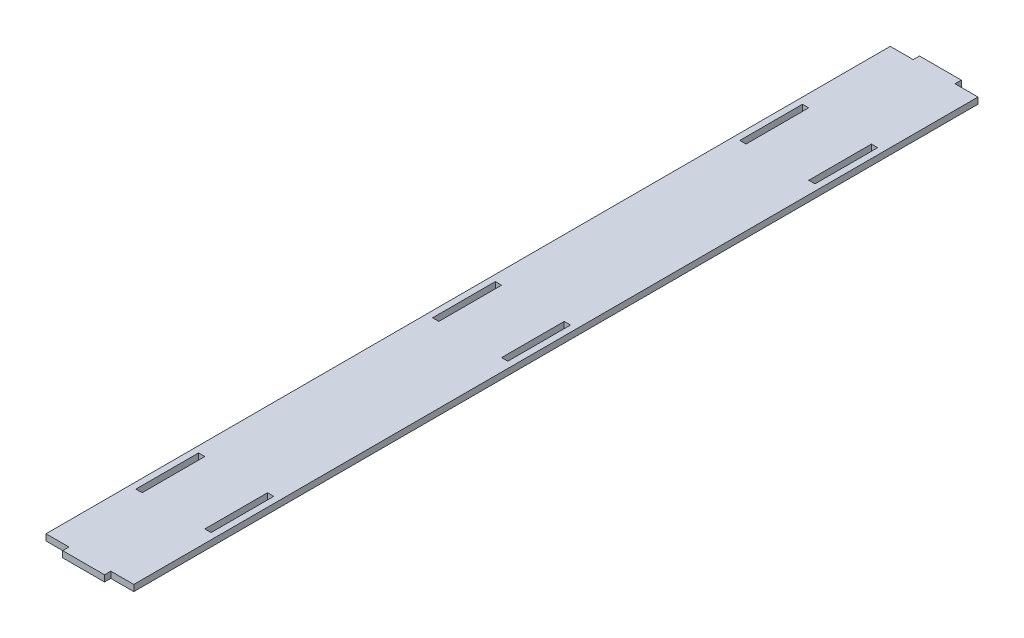
ISO-10303-21;
HEADER;
FILE_DESCRIPTION(('STEP AP214'),'2;1');
FILE_NAME('part.step','',(''),(''),'','','');
FILE_SCHEMA(('AUTOMOTIVE_DESIGN { 1 0 10303 214 1 1 1 1 }'));
ENDSEC;
DATA;
#1=APPLICATION_CONTEXT('core data for automotive mechanical design processes');
#2=APPLICATION_PROTOCOL_DEFINITION('international standard','automotive_design',2000,#1);
#3=PRODUCT_CONTEXT('',#1,'mechanical');
#4=PRODUCT('Part','Part','',(#3));
#5=PRODUCT_RELATED_PRODUCT_CATEGORY('part','',(#4));
#6=PRODUCT_DEFINITION_FORMATION('','',#4);
#7=PRODUCT_DEFINITION_CONTEXT('part definition',#1,'design');
#8=PRODUCT_DEFINITION('design','',#6,#7);
#9=PRODUCT_DEFINITION_SHAPE('','',#8);
#10=(LENGTH_UNIT() NAMED_UNIT(*) SI_UNIT(.MILLI.,.METRE.));
#11=(NAMED_UNIT(*) PLANE_ANGLE_UNIT() SI_UNIT($,.RADIAN.));
#12=(NAMED_UNIT(*) SI_UNIT($,.STERADIAN.) SOLID_ANGLE_UNIT());
#13=UNCERTAINTY_MEASURE_WITH_UNIT(LENGTH_MEASURE(1.E-05),#10,'distance_accuracy_value','');
#14=(GEOMETRIC_REPRESENTATION_CONTEXT(3) GLOBAL_UNCERTAINTY_ASSIGNED_CONTEXT((#13)) GLOBAL_UNIT_ASSIGNED_CONTEXT((#10,
#11,#12)) REPRESENTATION_CONTEXT('',''));
#15=CARTESIAN_POINT('',(0.,0.,0.));
#16=DIRECTION('',(0.,0.,1.));
#17=DIRECTION('',(1.,0.,0.));
#18=AXIS2_PLACEMENT_3D('',#15,#16,#17);
#19=CARTESIAN_POINT('',(0.,3.,-70.));
#20=DIRECTION('',(0.,0.,-1.));
#21=DIRECTION('',(-1.,0.,0.));
#22=AXIS2_PLACEMENT_3D('',#19,#20,#21);
#23=PLANE('',#22);
#24=DIRECTION('',(1.,0.,0.));
#25=VECTOR('',#24,1.);
#26=CARTESIAN_POINT('',(0.,0.,-70.));
#27=LINE('',#26,#25);
#28=CARTESIAN_POINT('',(36.,0.,-70.));
#29=VERTEX_POINT('',#28);
#30=CARTESIAN_POINT('',(39.,0.,-70.));
#31=VERTEX_POINT('',#30);
#32=EDGE_CURVE('E394',#29,#31,#27,.T.);
#33=ORIENTED_EDGE('',*,*,#32,.T.);
#34=DIRECTION('',(0.,-1.,0.));
#35=VECTOR('',#34,1.);
#36=CARTESIAN_POINT('',(39.,3.,-70.));
#37=LINE('',#36,#35);
#38=CARTESIAN_POINT('',(39.,3.,-70.));
#39=VERTEX_POINT('',#38);
#40=EDGE_CURVE('E11',#39,#31,#37,.T.);
#41=ORIENTED_EDGE('',*,*,#40,.F.);
#42=DIRECTION('',(1.,0.,0.));
#43=VECTOR('',#42,1.);
#44=CARTESIAN_POINT('',(0.,3.,-70.));
#45=LINE('',#44,#43);
#46=CARTESIAN_POINT('',(36.,3.,-70.));
#47=VERTEX_POINT('',#46);
#48=EDGE_CURVE('E282',#47,#39,#45,.T.);
#49=ORIENTED_EDGE('',*,*,#48,.F.);
#50=DIRECTION('',(0.,-1.,0.));
#51=VECTOR('',#50,1.);
#52=CARTESIAN_POINT('',(36.,3.,-70.));
#53=LINE('',#52,#51);
#54=EDGE_CURVE('E54',#47,#29,#53,.T.);
#55=ORIENTED_EDGE('',*,*,#54,.T.);
#56=EDGE_LOOP('',(#33,#41,#49,#55));
#57=FACE_BOUND('',#56,.T.);
#58=ADVANCED_FACE('F35',(#57),#23,.F.);
#59=CARTESIAN_POINT('',(39.,3.,0.));
#60=DIRECTION('',(1.,0.,0.));
#61=DIRECTION('',(0.,0.,-1.));
#62=AXIS2_PLACEMENT_3D('',#59,#60,#61);
#63=PLANE('',#62);
#64=DIRECTION('',(0.,0.,1.));
#65=VECTOR('',#64,1.);
#66=CARTESIAN_POINT('',(39.,0.,0.));
#67=LINE('',#66,#65);
#68=CARTESIAN_POINT('',(39.,0.,-40.));
#69=VERTEX_POINT('',#68);
#70=EDGE_CURVE('E288',#31,#69,#67,.T.);
#71=ORIENTED_EDGE('',*,*,#70,.T.);
#72=DIRECTION('',(0.,-1.,0.));
#73=VECTOR('',#72,1.);
#74=CARTESIAN_POINT('',(39.,3.,-40.));
#75=LINE('',#74,#73);
#76=CARTESIAN_POINT('',(39.,3.,-40.));
#77=VERTEX_POINT('',#76);
#78=EDGE_CURVE('E45',#77,#69,#75,.T.);
#79=ORIENTED_EDGE('',*,*,#78,.F.);
#80=DIRECTION('',(0.,0.,1.));
#81=VECTOR('',#80,1.);
#82=CARTESIAN_POINT('',(39.,3.,0.));
#83=LINE('',#82,#81);
#84=EDGE_CURVE('E276',#39,#77,#83,.T.);
#85=ORIENTED_EDGE('',*,*,#84,.F.);
#86=ORIENTED_EDGE('',*,*,#40,.T.);
#87=EDGE_LOOP('',(#71,#79,#85,#86));
#88=FACE_BOUND('',#87,.T.);
#89=ADVANCED_FACE('F287',(#88),#63,.F.);
#90=CARTESIAN_POINT('',(0.,3.,-40.));
#91=DIRECTION('',(0.,0.,-1.));
#92=DIRECTION('',(-1.,0.,0.));
#93=AXIS2_PLACEMENT_3D('',#90,#91,#92);
#94=PLANE('',#93);
#95=DIRECTION('',(1.,0.,0.));
#96=VECTOR('',#95,1.);
#97=CARTESIAN_POINT('',(0.,0.,-40.));
#98=LINE('',#97,#96);
#99=CARTESIAN_POINT('',(36.,0.,-40.));
#100=VERTEX_POINT('',#99);
#101=EDGE_CURVE('E397',#100,#69,#98,.T.);
#102=ORIENTED_EDGE('',*,*,#101,.F.);
#103=DIRECTION('',(0.,-1.,0.));
#104=VECTOR('',#103,1.);
#105=CARTESIAN_POINT('',(36.,3.,-40.));
#106=LINE('',#105,#104);
#107=CARTESIAN_POINT('',(36.,3.,-40.));
#108=VERTEX_POINT('',#107);
#109=EDGE_CURVE('E164',#108,#100,#106,.T.);
#110=ORIENTED_EDGE('',*,*,#109,.F.);
#111=DIRECTION('',(1.,0.,0.));
#112=VECTOR('',#111,1.);
#113=CARTESIAN_POINT('',(0.,3.,-40.));
#114=LINE('',#113,#112);
#115=EDGE_CURVE('E281',#108,#77,#114,.T.);
#116=ORIENTED_EDGE('',*,*,#115,.T.);
#117=ORIENTED_EDGE('',*,*,#78,.T.);
#118=EDGE_LOOP('',(#102,#110,#116,#117));
#119=FACE_BOUND('',#118,.T.);
#120=ADVANCED_FACE('F292',(#119),#94,.T.);
#121=CARTESIAN_POINT('',(0.,3.,-212.));
#122=DIRECTION('',(0.,0.,-1.));
#123=DIRECTION('',(-1.,0.,0.));
#124=AXIS2_PLACEMENT_3D('',#121,#122,#123);
#125=PLANE('',#124);
#126=DIRECTION('',(1.,0.,0.));
#127=VECTOR('',#126,1.);
#128=CARTESIAN_POINT('',(0.,0.,-212.));
#129=LINE('',#128,#127);
#130=CARTESIAN_POINT('',(36.,0.,-212.));
#131=VERTEX_POINT('',#130);
#132=CARTESIAN_POINT('',(39.,0.,-212.));
#133=VERTEX_POINT('',#132);
#134=EDGE_CURVE('E382',#131,#133,#129,.T.);
#135=ORIENTED_EDGE('',*,*,#134,.T.);
#136=DIRECTION('',(0.,-1.,0.));
#137=VECTOR('',#136,1.);
#138=CARTESIAN_POINT('',(39.,3.,-212.));
#139=LINE('',#138,#137);
#140=CARTESIAN_POINT('',(39.,3.,-212.));
#141=VERTEX_POINT('',#140);
#142=EDGE_CURVE('E404',#141,#133,#139,.T.);
#143=ORIENTED_EDGE('',*,*,#142,.F.);
#144=DIRECTION('',(1.,0.,0.));
#145=VECTOR('',#144,1.);
#146=CARTESIAN_POINT('',(0.,3.,-212.));
#147=LINE('',#146,#145);
#148=CARTESIAN_POINT('',(36.,3.,-212.));
#149=VERTEX_POINT('',#148);
#150=EDGE_CURVE('E874',#149,#141,#147,.T.);
#151=ORIENTED_EDGE('',*,*,#150,.F.);
#152=DIRECTION('',(0.,-1.,0.));
#153=VECTOR('',#152,1.);
#154=CARTESIAN_POINT('',(36.,3.,-212.));
#155=LINE('',#154,#153);
#156=EDGE_CURVE('E406',#149,#131,#155,.T.);
#157=ORIENTED_EDGE('',*,*,#156,.T.);
#158=EDGE_LOOP('',(#135,#143,#151,#157));
#159=FACE_BOUND('',#158,.T.);
#160=ADVANCED_FACE('F519',(#159),#125,.F.);
#161=CARTESIAN_POINT('',(39.,3.,0.));
#162=DIRECTION('',(1.,0.,0.));
#163=DIRECTION('',(0.,0.,-1.));
#164=AXIS2_PLACEMENT_3D('',#161,#162,#163);
#165=PLANE('',#164);
#166=DIRECTION('',(0.,0.,1.));
#167=VECTOR('',#166,1.);
#168=CARTESIAN_POINT('',(39.,0.,0.));
#169=LINE('',#168,#167);
#170=CARTESIAN_POINT('',(39.,0.,-182.));
#171=VERTEX_POINT('',#170);
#172=EDGE_CURVE('E385',#133,#171,#169,.T.);
#173=ORIENTED_EDGE('',*,*,#172,.T.);
#174=DIRECTION('',(0.,-1.,0.));
#175=VECTOR('',#174,1.);
#176=CARTESIAN_POINT('',(39.,3.,-182.));
#177=LINE('',#176,#175);
#178=CARTESIAN_POINT('',(39.,3.,-182.));
#179=VERTEX_POINT('',#178);
#180=EDGE_CURVE('E411',#179,#171,#177,.T.);
#181=ORIENTED_EDGE('',*,*,#180,.F.);
#182=DIRECTION('',(0.,0.,1.));
#183=VECTOR('',#182,1.);
#184=CARTESIAN_POINT('',(39.,3.,0.));
#185=LINE('',#184,#183);
#186=EDGE_CURVE('E872',#141,#179,#185,.T.);
#187=ORIENTED_EDGE('',*,*,#186,.F.);
#188=ORIENTED_EDGE('',*,*,#142,.T.);
#189=EDGE_LOOP('',(#173,#181,#187,#188));
#190=FACE_BOUND('',#189,.T.);
#191=ADVANCED_FACE('F515',(#190),#165,.F.);
#192=CARTESIAN_POINT('',(0.,3.,-182.));
#193=DIRECTION('',(0.,0.,-1.));
#194=DIRECTION('',(-1.,0.,0.));
#195=AXIS2_PLACEMENT_3D('',#192,#193,#194);
#196=PLANE('',#195);
#197=DIRECTION('',(1.,0.,0.));
#198=VECTOR('',#197,1.);
#199=CARTESIAN_POINT('',(0.,0.,-182.));
#200=LINE('',#199,#198);
#201=CARTESIAN_POINT('',(36.,0.,-182.));
#202=VERTEX_POINT('',#201);
#203=EDGE_CURVE('E388',#202,#171,#200,.T.);
#204=ORIENTED_EDGE('',*,*,#203,.F.);
#205=DIRECTION('',(0.,-1.,0.));
#206=VECTOR('',#205,1.);
#207=CARTESIAN_POINT('',(36.,3.,-182.));
#208=LINE('',#207,#206);
#209=CARTESIAN_POINT('',(36.,3.,-182.));
#210=VERTEX_POINT('',#209);
#211=EDGE_CURVE('E408',#210,#202,#208,.T.);
#212=ORIENTED_EDGE('',*,*,#211,.F.);
#213=DIRECTION('',(1.,0.,0.));
#214=VECTOR('',#213,1.);
#215=CARTESIAN_POINT('',(0.,3.,-182.));
#216=LINE('',#215,#214);
#217=EDGE_CURVE('E867',#210,#179,#216,.T.);
#218=ORIENTED_EDGE('',*,*,#217,.T.);
#219=ORIENTED_EDGE('',*,*,#180,.T.);
#220=EDGE_LOOP('',(#204,#212,#218,#219));
#221=FACE_BOUND('',#220,.T.);
#222=ADVANCED_FACE('F511',(#221),#196,.T.);
#223=CARTESIAN_POINT('',(0.,3.,-359.));
#224=DIRECTION('',(0.,0.,-1.));
#225=DIRECTION('',(-1.,0.,0.));
#226=AXIS2_PLACEMENT_3D('',#223,#224,#225);
#227=PLANE('',#226);
#228=DIRECTION('',(1.,0.,0.));
#229=VECTOR('',#228,1.);
#230=CARTESIAN_POINT('',(0.,0.,-359.));
#231=LINE('',#230,#229);
#232=CARTESIAN_POINT('',(36.,0.,-359.));
#233=VERTEX_POINT('',#232);
#234=CARTESIAN_POINT('',(39.,0.,-359.));
#235=VERTEX_POINT('',#234);
#236=EDGE_CURVE('E370',#233,#235,#231,.T.);
#237=ORIENTED_EDGE('',*,*,#236,.T.);
#238=DIRECTION('',(0.,-1.,0.));
#239=VECTOR('',#238,1.);
#240=CARTESIAN_POINT('',(39.,3.,-359.));
#241=LINE('',#240,#239);
#242=CARTESIAN_POINT('',(39.,3.,-359.));
#243=VERTEX_POINT('',#242);
#244=EDGE_CURVE('E409',#243,#235,#241,.T.);
#245=ORIENTED_EDGE('',*,*,#244,.F.);
#246=DIRECTION('',(1.,0.,0.));
#247=VECTOR('',#246,1.);
#248=CARTESIAN_POINT('',(0.,3.,-359.));
#249=LINE('',#248,#247);
#250=CARTESIAN_POINT('',(36.,3.,-359.));
#251=VERTEX_POINT('',#250);
#252=EDGE_CURVE('E885',#251,#243,#249,.T.);
#253=ORIENTED_EDGE('',*,*,#252,.F.);
#254=DIRECTION('',(0.,-1.,0.));
#255=VECTOR('',#254,1.);
#256=CARTESIAN_POINT('',(36.,3.,-359.));
#257=LINE('',#256,#255);
#258=EDGE_CURVE('E415',#251,#233,#257,.T.);
#259=ORIENTED_EDGE('',*,*,#258,.T.);
#260=EDGE_LOOP('',(#237,#245,#253,#259));
#261=FACE_BOUND('',#260,.T.);
#262=ADVANCED_FACE('F514',(#261),#227,.F.);
#263=CARTESIAN_POINT('',(39.,3.,0.));
#264=DIRECTION('',(1.,0.,0.));
#265=DIRECTION('',(0.,0.,-1.));
#266=AXIS2_PLACEMENT_3D('',#263,#264,#265);
#267=PLANE('',#266);
#268=DIRECTION('',(0.,0.,1.));
#269=VECTOR('',#268,1.);
#270=CARTESIAN_POINT('',(39.,0.,0.));
#271=LINE('',#270,#269);
#272=CARTESIAN_POINT('',(39.,0.,-329.));
#273=VERTEX_POINT('',#272);
#274=EDGE_CURVE('E373',#235,#273,#271,.T.);
#275=ORIENTED_EDGE('',*,*,#274,.T.);
#276=DIRECTION('',(0.,-1.,0.));
#277=VECTOR('',#276,1.);
#278=CARTESIAN_POINT('',(39.,3.,-329.));
#279=LINE('',#278,#277);
#280=CARTESIAN_POINT('',(39.,3.,-329.));
#281=VERTEX_POINT('',#280);
#282=EDGE_CURVE('E420',#281,#273,#279,.T.);
#283=ORIENTED_EDGE('',*,*,#282,.F.);
#284=DIRECTION('',(0.,0.,1.));
#285=VECTOR('',#284,1.);
#286=CARTESIAN_POINT('',(39.,3.,0.));
#287=LINE('',#286,#285);
#288=EDGE_CURVE('E883',#243,#281,#287,.T.);
#289=ORIENTED_EDGE('',*,*,#288,.F.);
#290=ORIENTED_EDGE('',*,*,#244,.T.);
#291=EDGE_LOOP('',(#275,#283,#289,#290));
#292=FACE_BOUND('',#291,.T.);
#293=ADVANCED_FACE('F532',(#292),#267,.F.);
#294=CARTESIAN_POINT('',(0.,3.,-329.));
#295=DIRECTION('',(0.,0.,-1.));
#296=DIRECTION('',(-1.,0.,0.));
#297=AXIS2_PLACEMENT_3D('',#294,#295,#296);
#298=PLANE('',#297);
#299=DIRECTION('',(1.,0.,0.));
#300=VECTOR('',#299,1.);
#301=CARTESIAN_POINT('',(0.,0.,-329.));
#302=LINE('',#301,#300);
#303=CARTESIAN_POINT('',(36.,0.,-329.));
#304=VERTEX_POINT('',#303);
#305=EDGE_CURVE('E376',#304,#273,#302,.T.);
#306=ORIENTED_EDGE('',*,*,#305,.F.);
#307=DIRECTION('',(0.,-1.,0.));
#308=VECTOR('',#307,1.);
#309=CARTESIAN_POINT('',(36.,3.,-329.));
#310=LINE('',#309,#308);
#311=CARTESIAN_POINT('',(36.,3.,-329.));
#312=VERTEX_POINT('',#311);
#313=EDGE_CURVE('E417',#312,#304,#310,.T.);
#314=ORIENTED_EDGE('',*,*,#313,.F.);
#315=DIRECTION('',(1.,0.,0.));
#316=VECTOR('',#315,1.);
#317=CARTESIAN_POINT('',(0.,3.,-329.));
#318=LINE('',#317,#316);
#319=EDGE_CURVE('E880',#312,#281,#318,.T.);
#320=ORIENTED_EDGE('',*,*,#319,.T.);
#321=ORIENTED_EDGE('',*,*,#282,.T.);
#322=EDGE_LOOP('',(#306,#314,#320,#321));
#323=FACE_BOUND('',#322,.T.);
#324=ADVANCED_FACE('F528',(#323),#298,.T.);
#325=CARTESIAN_POINT('',(0.,3.,-404.));
#326=DIRECTION('',(0.,0.,-1.));
#327=DIRECTION('',(-1.,0.,0.));
#328=AXIS2_PLACEMENT_3D('',#325,#326,#327);
#329=PLANE('',#328);
#330=DIRECTION('',(1.,0.,0.));
#331=VECTOR('',#330,1.);
#332=CARTESIAN_POINT('',(0.,0.,-404.));
#333=LINE('',#332,#331);
#334=CARTESIAN_POINT('',(31.,0.,-404.));
#335=VERTEX_POINT('',#334);
#336=CARTESIAN_POINT('',(42.,0.,-404.));
#337=VERTEX_POINT('',#336);
#338=EDGE_CURVE('E334',#335,#337,#333,.T.);
#339=ORIENTED_EDGE('',*,*,#338,.F.);
#340=DIRECTION('',(0.,-1.,0.));
#341=VECTOR('',#340,1.);
#342=CARTESIAN_POINT('',(31.,3.,-404.));
#343=LINE('',#342,#341);
#344=CARTESIAN_POINT('',(31.,3.,-404.));
#345=VERTEX_POINT('',#344);
#346=EDGE_CURVE('E418',#345,#335,#343,.T.);
#347=ORIENTED_EDGE('',*,*,#346,.F.);
#348=DIRECTION('',(1.,0.,0.));
#349=VECTOR('',#348,1.);
#350=CARTESIAN_POINT('',(0.,3.,-404.));
#351=LINE('',#350,#349);
#352=CARTESIAN_POINT('',(42.,3.,-404.));
#353=VERTEX_POINT('',#352);
#354=EDGE_CURVE('E918',#345,#353,#351,.T.);
#355=ORIENTED_EDGE('',*,*,#354,.T.);
#356=DIRECTION('',(0.,-1.,0.));
#357=VECTOR('',#356,1.);
#358=CARTESIAN_POINT('',(42.,3.,-404.));
#359=LINE('',#358,#357);
#360=EDGE_CURVE('E424',#353,#337,#359,.T.);
#361=ORIENTED_EDGE('',*,*,#360,.T.);
#362=EDGE_LOOP('',(#339,#347,#355,#361));
#363=FACE_BOUND('',#362,.T.);
#364=ADVANCED_FACE('F531',(#363),#329,.T.);
#365=CARTESIAN_POINT('',(31.0000000000009,3.,0.));
#366=DIRECTION('',(-1.,0.,0.));
#367=DIRECTION('',(0.,0.,1.));
#368=AXIS2_PLACEMENT_3D('',#365,#366,#367);
#369=PLANE('',#368);
#370=DIRECTION('',(0.,0.,-1.));
#371=VECTOR('',#370,1.);
#372=CARTESIAN_POINT('',(31.0000000000009,0.,0.));
#373=LINE('',#372,#371);
#374=CARTESIAN_POINT('',(31.,0.,-407.));
#375=VERTEX_POINT('',#374);
#376=EDGE_CURVE('E337',#335,#375,#373,.T.);
#377=ORIENTED_EDGE('',*,*,#376,.T.);
#378=DIRECTION('',(0.,-1.,0.));
#379=VECTOR('',#378,1.);
#380=CARTESIAN_POINT('',(31.,3.,-407.));
#381=LINE('',#380,#379);
#382=CARTESIAN_POINT('',(31.,3.,-407.));
#383=VERTEX_POINT('',#382);
#384=EDGE_CURVE('E448',#383,#375,#381,.T.);
#385=ORIENTED_EDGE('',*,*,#384,.F.);
#386=DIRECTION('',(0.,0.,-1.));
#387=VECTOR('',#386,1.);
#388=CARTESIAN_POINT('',(31.0000000000009,3.,0.));
#389=LINE('',#388,#387);
#390=EDGE_CURVE('E916',#345,#383,#389,.T.);
#391=ORIENTED_EDGE('',*,*,#390,.F.);
#392=ORIENTED_EDGE('',*,*,#346,.T.);
#393=EDGE_LOOP('',(#377,#385,#391,#392));
#394=FACE_BOUND('',#393,.T.);
#395=ADVANCED_FACE('F580',(#394),#369,.F.);
#396=CARTESIAN_POINT('',(1.1296519275561E-12,3.,-407.));
#397=DIRECTION('',(0.,0.,-1.));
#398=DIRECTION('',(-1.,0.,0.));
#399=AXIS2_PLACEMENT_3D('',#396,#397,#398);
#400=PLANE('',#399);
#401=DIRECTION('',(1.,0.,0.));
#402=VECTOR('',#401,1.);
#403=CARTESIAN_POINT('',(1.1296519275561E-12,0.,-407.));
#404=LINE('',#403,#402);
#405=CARTESIAN_POINT('',(11.,0.,-407.));
#406=VERTEX_POINT('',#405);
#407=EDGE_CURVE('E340',#406,#375,#404,.T.);
#408=ORIENTED_EDGE('',*,*,#407,.F.);
#409=DIRECTION('',(0.,-1.,0.));
#410=VECTOR('',#409,1.);
#411=CARTESIAN_POINT('',(11.,3.,-407.));
#412=LINE('',#411,#410);
#413=CARTESIAN_POINT('',(11.,3.,-407.));
#414=VERTEX_POINT('',#413);
#415=EDGE_CURVE('E446',#414,#406,#412,.T.);
#416=ORIENTED_EDGE('',*,*,#415,.F.);
#417=DIRECTION('',(1.,0.,0.));
#418=VECTOR('',#417,1.);
#419=CARTESIAN_POINT('',(1.1296519275561E-12,3.,-407.));
#420=LINE('',#419,#418);
#421=EDGE_CURVE('E913',#414,#383,#420,.T.);
#422=ORIENTED_EDGE('',*,*,#421,.T.);
#423=ORIENTED_EDGE('',*,*,#384,.T.);
#424=EDGE_LOOP('',(#408,#416,#422,#423));
#425=FACE_BOUND('',#424,.T.);
#426=ADVANCED_FACE('F576',(#425),#400,.T.);
#427=CARTESIAN_POINT('',(11.0000000000002,3.,0.));
#428=DIRECTION('',(-1.,0.,0.));
#429=DIRECTION('',(0.,0.,1.));
#430=AXIS2_PLACEMENT_3D('',#427,#428,#429);
#431=PLANE('',#430);
#432=DIRECTION('',(0.,0.,-1.));
#433=VECTOR('',#432,1.);
#434=CARTESIAN_POINT('',(11.0000000000002,0.,0.));
#435=LINE('',#434,#433);
#436=CARTESIAN_POINT('',(11.,0.,-404.));
#437=VERTEX_POINT('',#436);
#438=EDGE_CURVE('E343',#437,#406,#435,.T.);
#439=ORIENTED_EDGE('',*,*,#438,.F.);
#440=DIRECTION('',(0.,-1.,0.));
#441=VECTOR('',#440,1.);
#442=CARTESIAN_POINT('',(11.,3.,-404.));
#443=LINE('',#442,#441);
#444=CARTESIAN_POINT('',(11.,3.,-404.));
#445=VERTEX_POINT('',#444);
#446=EDGE_CURVE('E444',#445,#437,#443,.T.);
#447=ORIENTED_EDGE('',*,*,#446,.F.);
#448=DIRECTION('',(0.,0.,-1.));
#449=VECTOR('',#448,1.);
#450=CARTESIAN_POINT('',(11.0000000000002,3.,0.));
#451=LINE('',#450,#449);
#452=EDGE_CURVE('E910',#445,#414,#451,.T.);
#453=ORIENTED_EDGE('',*,*,#452,.T.);
#454=ORIENTED_EDGE('',*,*,#415,.T.);
#455=EDGE_LOOP('',(#439,#447,#453,#454));
#456=FACE_BOUND('',#455,.T.);
#457=ADVANCED_FACE('F572',(#456),#431,.T.);
#458=CARTESIAN_POINT('',(0.,3.,-404.));
#459=DIRECTION('',(0.,0.,-1.));
#460=DIRECTION('',(-1.,0.,0.));
#461=AXIS2_PLACEMENT_3D('',#458,#459,#460);
#462=PLANE('',#461);
#463=DIRECTION('',(1.,0.,0.));
#464=VECTOR('',#463,1.);
#465=CARTESIAN_POINT('',(0.,0.,-404.));
#466=LINE('',#465,#464);
#467=CARTESIAN_POINT('',(0.,0.,-404.));
#468=VERTEX_POINT('',#467);
#469=EDGE_CURVE('E346',#468,#437,#466,.T.);
#470=ORIENTED_EDGE('',*,*,#469,.F.);
#471=DIRECTION('',(0.,-1.,0.));
#472=VECTOR('',#471,1.);
#473=CARTESIAN_POINT('',(0.,3.,-404.));
#474=LINE('',#473,#472);
#475=CARTESIAN_POINT('',(0.,3.,-404.));
#476=VERTEX_POINT('',#475);
#477=EDGE_CURVE('E442',#476,#468,#474,.T.);
#478=ORIENTED_EDGE('',*,*,#477,.F.);
#479=DIRECTION('',(1.,0.,0.));
#480=VECTOR('',#479,1.);
#481=CARTESIAN_POINT('',(0.,3.,-404.));
#482=LINE('',#481,#480);
#483=EDGE_CURVE('E907',#476,#445,#482,.T.);
#484=ORIENTED_EDGE('',*,*,#483,.T.);
#485=ORIENTED_EDGE('',*,*,#446,.T.);
#486=EDGE_LOOP('',(#470,#478,#484,#485));
#487=FACE_BOUND('',#486,.T.);
#488=ADVANCED_FACE('F568',(#487),#462,.T.);
#489=CARTESIAN_POINT('',(0.,3.,0.));
#490=DIRECTION('',(-1.,0.,0.));
#491=DIRECTION('',(0.,0.,1.));
#492=AXIS2_PLACEMENT_3D('',#489,#490,#491);
#493=PLANE('',#492);
#494=DIRECTION('',(0.,0.,-1.));
#495=VECTOR('',#494,1.);
#496=CARTESIAN_POINT('',(0.,0.,0.));
#497=LINE('',#496,#495);
#498=CARTESIAN_POINT('',(0.,0.,0.));
#499=VERTEX_POINT('',#498);
#500=EDGE_CURVE('E349',#499,#468,#497,.T.);
#501=ORIENTED_EDGE('',*,*,#500,.F.);
#502=DIRECTION('',(0.,-1.,0.));
#503=VECTOR('',#502,1.);
#504=CARTESIAN_POINT('',(0.,3.,0.));
#505=LINE('',#504,#503);
#506=CARTESIAN_POINT('',(0.,3.,0.));
#507=VERTEX_POINT('',#506);
#508=EDGE_CURVE('E440',#507,#499,#505,.T.);
#509=ORIENTED_EDGE('',*,*,#508,.F.);
#510=DIRECTION('',(0.,0.,-1.));
#511=VECTOR('',#510,1.);
#512=CARTESIAN_POINT('',(0.,3.,0.));
#513=LINE('',#512,#511);
#514=EDGE_CURVE('E904',#507,#476,#513,.T.);
#515=ORIENTED_EDGE('',*,*,#514,.T.);
#516=ORIENTED_EDGE('',*,*,#477,.T.);
#517=EDGE_LOOP('',(#501,#509,#515,#516));
#518=FACE_BOUND('',#517,.T.);
#519=ADVANCED_FACE('F564',(#518),#493,.T.);
#520=CARTESIAN_POINT('',(0.,3.,0.));
#521=DIRECTION('',(0.,0.,-1.));
#522=DIRECTION('',(-1.,0.,0.));
#523=AXIS2_PLACEMENT_3D('',#520,#521,#522);
#524=PLANE('',#523);
#525=DIRECTION('',(1.,0.,0.));
#526=VECTOR('',#525,1.);
#527=CARTESIAN_POINT('',(0.,0.,0.));
#528=LINE('',#527,#526);
#529=CARTESIAN_POINT('',(11.,0.,0.));
#530=VERTEX_POINT('',#529);
#531=EDGE_CURVE('E352',#499,#530,#528,.T.);
#532=ORIENTED_EDGE('',*,*,#531,.T.);
#533=DIRECTION('',(0.,-1.,0.));
#534=VECTOR('',#533,1.);
#535=CARTESIAN_POINT('',(11.,3.,0.));
#536=LINE('',#535,#534);
#537=CARTESIAN_POINT('',(11.,3.,0.));
#538=VERTEX_POINT('',#537);
#539=EDGE_CURVE('E437',#538,#530,#536,.T.);
#540=ORIENTED_EDGE('',*,*,#539,.F.);
#541=DIRECTION('',(1.,0.,0.));
#542=VECTOR('',#541,1.);
#543=CARTESIAN_POINT('',(0.,3.,0.));
#544=LINE('',#543,#542);
#545=EDGE_CURVE('E901',#507,#538,#544,.T.);
#546=ORIENTED_EDGE('',*,*,#545,.F.);
#547=ORIENTED_EDGE('',*,*,#508,.T.);
#548=EDGE_LOOP('',(#532,#540,#546,#547));
#549=FACE_BOUND('',#548,.T.);
#550=ADVANCED_FACE('F560',(#549),#524,.F.);
#551=CARTESIAN_POINT('',(11.,3.,0.));
#552=DIRECTION('',(1.,0.,0.));
#553=DIRECTION('',(0.,0.,-1.));
#554=AXIS2_PLACEMENT_3D('',#551,#552,#553);
#555=PLANE('',#554);
#556=DIRECTION('',(0.,0.,1.));
#557=VECTOR('',#556,1.);
#558=CARTESIAN_POINT('',(11.,0.,0.));
#559=LINE('',#558,#557);
#560=CARTESIAN_POINT('',(11.,0.,3.));
#561=VERTEX_POINT('',#560);
#562=EDGE_CURVE('E355',#530,#561,#559,.T.);
#563=ORIENTED_EDGE('',*,*,#562,.T.);
#564=DIRECTION('',(0.,-1.,0.));
#565=VECTOR('',#564,1.);
#566=CARTESIAN_POINT('',(11.,3.,3.));
#567=LINE('',#566,#565);
#568=CARTESIAN_POINT('',(11.,3.,3.));
#569=VERTEX_POINT('',#568);
#570=EDGE_CURVE('E434',#569,#561,#567,.T.);
#571=ORIENTED_EDGE('',*,*,#570,.F.);
#572=DIRECTION('',(0.,0.,1.));
#573=VECTOR('',#572,1.);
#574=CARTESIAN_POINT('',(11.,3.,0.));
#575=LINE('',#574,#573);
#576=EDGE_CURVE('E898',#538,#569,#575,.T.);
#577=ORIENTED_EDGE('',*,*,#576,.F.);
#578=ORIENTED_EDGE('',*,*,#539,.T.);
#579=EDGE_LOOP('',(#563,#571,#577,#578));
#580=FACE_BOUND('',#579,.T.);
#581=ADVANCED_FACE('F556',(#580),#555,.F.);
#582=CARTESIAN_POINT('',(0.,3.,3.));
#583=DIRECTION('',(0.,0.,-1.));
#584=DIRECTION('',(-1.,0.,0.));
#585=AXIS2_PLACEMENT_3D('',#582,#583,#584);
#586=PLANE('',#585);
#587=DIRECTION('',(1.,0.,0.));
#588=VECTOR('',#587,1.);
#589=CARTESIAN_POINT('',(0.,0.,3.));
#590=LINE('',#589,#588);
#591=CARTESIAN_POINT('',(31.,0.,3.));
#592=VERTEX_POINT('',#591);
#593=EDGE_CURVE('E358',#561,#592,#590,.T.);
#594=ORIENTED_EDGE('',*,*,#593,.T.);
#595=DIRECTION('',(0.,-1.,0.));
#596=VECTOR('',#595,1.);
#597=CARTESIAN_POINT('',(31.,3.,3.));
#598=LINE('',#597,#596);
#599=CARTESIAN_POINT('',(31.,3.,3.));
#600=VERTEX_POINT('',#599);
#601=EDGE_CURVE('E432',#600,#592,#598,.T.);
#602=ORIENTED_EDGE('',*,*,#601,.F.);
#603=DIRECTION('',(1.,0.,0.));
#604=VECTOR('',#603,1.);
#605=CARTESIAN_POINT('',(0.,3.,3.));
#606=LINE('',#605,#604);
#607=EDGE_CURVE('E896',#569,#600,#606,.T.);
#608=ORIENTED_EDGE('',*,*,#607,.F.);
#609=ORIENTED_EDGE('',*,*,#570,.T.);
#610=EDGE_LOOP('',(#594,#602,#608,#609));
#611=FACE_BOUND('',#610,.T.);
#612=ADVANCED_FACE('F552',(#611),#586,.F.);
#613=CARTESIAN_POINT('',(31.,3.,0.));
#614=DIRECTION('',(1.,0.,0.));
#615=DIRECTION('',(0.,0.,-1.));
#616=AXIS2_PLACEMENT_3D('',#613,#614,#615);
#617=PLANE('',#616);
#618=DIRECTION('',(0.,0.,1.));
#619=VECTOR('',#618,1.);
#620=CARTESIAN_POINT('',(31.,0.,0.));
#621=LINE('',#620,#619);
#622=CARTESIAN_POINT('',(31.,0.,0.));
#623=VERTEX_POINT('',#622);
#624=EDGE_CURVE('E361',#623,#592,#621,.T.);
#625=ORIENTED_EDGE('',*,*,#624,.F.);
#626=DIRECTION('',(0.,-1.,0.));
#627=VECTOR('',#626,1.);
#628=CARTESIAN_POINT('',(31.,3.,0.));
#629=LINE('',#628,#627);
#630=CARTESIAN_POINT('',(31.,3.,0.));
#631=VERTEX_POINT('',#630);
#632=EDGE_CURVE('E430',#631,#623,#629,.T.);
#633=ORIENTED_EDGE('',*,*,#632,.F.);
#634=DIRECTION('',(0.,0.,1.));
#635=VECTOR('',#634,1.);
#636=CARTESIAN_POINT('',(31.,3.,0.));
#637=LINE('',#636,#635);
#638=EDGE_CURVE('E893',#631,#600,#637,.T.);
#639=ORIENTED_EDGE('',*,*,#638,.T.);
#640=ORIENTED_EDGE('',*,*,#601,.T.);
#641=EDGE_LOOP('',(#625,#633,#639,#640));
#642=FACE_BOUND('',#641,.T.);
#643=ADVANCED_FACE('F548',(#642),#617,.T.);
#644=CARTESIAN_POINT('',(0.,3.,0.));
#645=DIRECTION('',(0.,0.,-1.));
#646=DIRECTION('',(-1.,0.,0.));
#647=AXIS2_PLACEMENT_3D('',#644,#645,#646);
#648=PLANE('',#647);
#649=DIRECTION('',(1.,0.,0.));
#650=VECTOR('',#649,1.);
#651=CARTESIAN_POINT('',(0.,0.,0.));
#652=LINE('',#651,#650);
#653=CARTESIAN_POINT('',(42.,0.,0.));
#654=VERTEX_POINT('',#653);
#655=EDGE_CURVE('E364',#623,#654,#652,.T.);
#656=ORIENTED_EDGE('',*,*,#655,.T.);
#657=DIRECTION('',(0.,-1.,0.));
#658=VECTOR('',#657,1.);
#659=CARTESIAN_POINT('',(42.,3.,0.));
#660=LINE('',#659,#658);
#661=CARTESIAN_POINT('',(42.,3.,0.));
#662=VERTEX_POINT('',#661);
#663=EDGE_CURVE('E426',#662,#654,#660,.T.);
#664=ORIENTED_EDGE('',*,*,#663,.F.);
#665=DIRECTION('',(1.,0.,0.));
#666=VECTOR('',#665,1.);
#667=CARTESIAN_POINT('',(0.,3.,0.));
#668=LINE('',#667,#666);
#669=EDGE_CURVE('E890',#631,#662,#668,.T.);
#670=ORIENTED_EDGE('',*,*,#669,.F.);
#671=ORIENTED_EDGE('',*,*,#632,.T.);
#672=EDGE_LOOP('',(#656,#664,#670,#671));
#673=FACE_BOUND('',#672,.T.);
#674=ADVANCED_FACE('F544',(#673),#648,.F.);
#675=CARTESIAN_POINT('',(0.,3.,-70.));
#676=DIRECTION('',(0.,0.,1.));
#677=DIRECTION('',(1.,0.,0.));
#678=AXIS2_PLACEMENT_3D('',#675,#676,#677);
#679=PLANE('',#678);
#680=DIRECTION('',(-1.,0.,0.));
#681=VECTOR('',#680,1.);
#682=CARTESIAN_POINT('',(0.,0.,-70.));
#683=LINE('',#682,#681);
#684=CARTESIAN_POINT('',(6.00000000000006,0.,-70.));
#685=VERTEX_POINT('',#684);
#686=CARTESIAN_POINT('',(3.00000000000006,0.,-70.));
#687=VERTEX_POINT('',#686);
#688=EDGE_CURVE('E322',#685,#687,#683,.T.);
#689=ORIENTED_EDGE('',*,*,#688,.F.);
#690=DIRECTION('',(0.,-1.,0.));
#691=VECTOR('',#690,1.);
#692=CARTESIAN_POINT('',(6.00000000000006,3.,-70.));
#693=LINE('',#692,#691);
#694=CARTESIAN_POINT('',(6.00000000000006,3.,-70.));
#695=VERTEX_POINT('',#694);
#696=EDGE_CURVE('E427',#695,#685,#693,.T.);
#697=ORIENTED_EDGE('',*,*,#696,.F.);
#698=DIRECTION('',(-1.,0.,0.));
#699=VECTOR('',#698,1.);
#700=CARTESIAN_POINT('',(0.,3.,-70.));
#701=LINE('',#700,#699);
#702=CARTESIAN_POINT('',(3.00000000000006,3.,-70.));
#703=VERTEX_POINT('',#702);
#704=EDGE_CURVE('E929',#695,#703,#701,.T.);
#705=ORIENTED_EDGE('',*,*,#704,.T.);
#706=DIRECTION('',(0.,-1.,0.));
#707=VECTOR('',#706,1.);
#708=CARTESIAN_POINT('',(3.00000000000006,3.,-70.));
#709=LINE('',#708,#707);
#710=EDGE_CURVE('E451',#703,#687,#709,.T.);
#711=ORIENTED_EDGE('',*,*,#710,.T.);
#712=EDGE_LOOP('',(#689,#697,#705,#711));
#713=FACE_BOUND('',#712,.T.);
#714=ADVANCED_FACE('F547',(#713),#679,.T.);
#715=CARTESIAN_POINT('',(6.00000000000006,3.,0.));
#716=DIRECTION('',(1.,0.,0.));
#717=DIRECTION('',(0.,0.,-1.));
#718=AXIS2_PLACEMENT_3D('',#715,#716,#717);
#719=PLANE('',#718);
#720=DIRECTION('',(0.,0.,1.));
#721=VECTOR('',#720,1.);
#722=CARTESIAN_POINT('',(6.00000000000006,0.,0.));
#723=LINE('',#722,#721);
#724=CARTESIAN_POINT('',(6.00000000000006,0.,-40.));
#725=VERTEX_POINT('',#724);
#726=EDGE_CURVE('E325',#685,#725,#723,.T.);
#727=ORIENTED_EDGE('',*,*,#726,.T.);
#728=DIRECTION('',(0.,-1.,0.));
#729=VECTOR('',#728,1.);
#730=CARTESIAN_POINT('',(6.00000000000006,3.,-40.));
#731=LINE('',#730,#729);
#732=CARTESIAN_POINT('',(6.00000000000006,3.,-40.));
#733=VERTEX_POINT('',#732);
#734=EDGE_CURVE('E456',#733,#725,#731,.T.);
#735=ORIENTED_EDGE('',*,*,#734,.F.);
#736=DIRECTION('',(0.,0.,1.));
#737=VECTOR('',#736,1.);
#738=CARTESIAN_POINT('',(6.00000000000006,3.,0.));
#739=LINE('',#738,#737);
#740=EDGE_CURVE('E926',#695,#733,#739,.T.);
#741=ORIENTED_EDGE('',*,*,#740,.F.);
#742=ORIENTED_EDGE('',*,*,#696,.T.);
#743=EDGE_LOOP('',(#727,#735,#741,#742));
#744=FACE_BOUND('',#743,.T.);
#745=ADVANCED_FACE('F596',(#744),#719,.F.);
#746=CARTESIAN_POINT('',(0.,3.,-40.));
#747=DIRECTION('',(0.,0.,1.));
#748=DIRECTION('',(1.,0.,0.));
#749=AXIS2_PLACEMENT_3D('',#746,#747,#748);
#750=PLANE('',#749);
#751=DIRECTION('',(-1.,0.,0.));
#752=VECTOR('',#751,1.);
#753=CARTESIAN_POINT('',(0.,0.,-40.));
#754=LINE('',#753,#752);
#755=CARTESIAN_POINT('',(3.00000000000006,0.,-40.));
#756=VERTEX_POINT('',#755);
#757=EDGE_CURVE('E328',#725,#756,#754,.T.);
#758=ORIENTED_EDGE('',*,*,#757,.T.);
#759=DIRECTION('',(0.,-1.,0.));
#760=VECTOR('',#759,1.);
#761=CARTESIAN_POINT('',(3.00000000000006,3.,-40.));
#762=LINE('',#761,#760);
#763=CARTESIAN_POINT('',(3.00000000000006,3.,-40.));
#764=VERTEX_POINT('',#763);
#765=EDGE_CURVE('E453',#764,#756,#762,.T.);
#766=ORIENTED_EDGE('',*,*,#765,.F.);
#767=DIRECTION('',(-1.,0.,0.));
#768=VECTOR('',#767,1.);
#769=CARTESIAN_POINT('',(0.,3.,-40.));
#770=LINE('',#769,#768);
#771=EDGE_CURVE('E924',#733,#764,#770,.T.);
#772=ORIENTED_EDGE('',*,*,#771,.F.);
#773=ORIENTED_EDGE('',*,*,#734,.T.);
#774=EDGE_LOOP('',(#758,#766,#772,#773));
#775=FACE_BOUND('',#774,.T.);
#776=ADVANCED_FACE('F592',(#775),#750,.F.);
#777=CARTESIAN_POINT('',(0.,3.,-212.));
#778=DIRECTION('',(0.,0.,1.));
#779=DIRECTION('',(1.,0.,0.));
#780=AXIS2_PLACEMENT_3D('',#777,#778,#779);
#781=PLANE('',#780);
#782=DIRECTION('',(-1.,0.,0.));
#783=VECTOR('',#782,1.);
#784=CARTESIAN_POINT('',(0.,0.,-212.));
#785=LINE('',#784,#783);
#786=CARTESIAN_POINT('',(6.00000000000007,0.,-212.));
#787=VERTEX_POINT('',#786);
#788=CARTESIAN_POINT('',(3.00000000000009,0.,-212.));
#789=VERTEX_POINT('',#788);
#790=EDGE_CURVE('E310',#787,#789,#785,.T.);
#791=ORIENTED_EDGE('',*,*,#790,.F.);
#792=DIRECTION('',(0.,-1.,0.));
#793=VECTOR('',#792,1.);
#794=CARTESIAN_POINT('',(6.00000000000007,3.,-212.));
#795=LINE('',#794,#793);
#796=CARTESIAN_POINT('',(6.00000000000007,3.,-212.));
#797=VERTEX_POINT('',#796);
#798=EDGE_CURVE('E454',#797,#787,#795,.T.);
#799=ORIENTED_EDGE('',*,*,#798,.F.);
#800=DIRECTION('',(-1.,0.,0.));
#801=VECTOR('',#800,1.);
#802=CARTESIAN_POINT('',(0.,3.,-212.));
#803=LINE('',#802,#801);
#804=CARTESIAN_POINT('',(3.00000000000009,3.,-212.));
#805=VERTEX_POINT('',#804);
#806=EDGE_CURVE('E940',#797,#805,#803,.T.);
#807=ORIENTED_EDGE('',*,*,#806,.T.);
#808=DIRECTION('',(0.,-1.,0.));
#809=VECTOR('',#808,1.);
#810=CARTESIAN_POINT('',(3.00000000000009,3.,-212.));
#811=LINE('',#810,#809);
#812=EDGE_CURVE('E460',#805,#789,#811,.T.);
#813=ORIENTED_EDGE('',*,*,#812,.T.);
#814=EDGE_LOOP('',(#791,#799,#807,#813));
#815=FACE_BOUND('',#814,.T.);
#816=ADVANCED_FACE('F595',(#815),#781,.T.);
#817=CARTESIAN_POINT('',(6.00000000000012,3.,0.));
#818=DIRECTION('',(1.,0.,0.));
#819=DIRECTION('',(0.,0.,-1.));
#820=AXIS2_PLACEMENT_3D('',#817,#818,#819);
#821=PLANE('',#820);
#822=DIRECTION('',(0.,0.,1.));
#823=VECTOR('',#822,1.);
#824=CARTESIAN_POINT('',(6.00000000000012,0.,0.));
#825=LINE('',#824,#823);
#826=CARTESIAN_POINT('',(6.00000000000007,0.,-182.));
#827=VERTEX_POINT('',#826);
#828=EDGE_CURVE('E313',#787,#827,#825,.T.);
#829=ORIENTED_EDGE('',*,*,#828,.T.);
#830=DIRECTION('',(0.,-1.,0.));
#831=VECTOR('',#830,1.);
#832=CARTESIAN_POINT('',(6.00000000000007,3.,-182.));
#833=LINE('',#832,#831);
#834=CARTESIAN_POINT('',(6.00000000000007,3.,-182.));
#835=VERTEX_POINT('',#834);
#836=EDGE_CURVE('E464',#835,#827,#833,.T.);
#837=ORIENTED_EDGE('',*,*,#836,.F.);
#838=DIRECTION('',(0.,0.,1.));
#839=VECTOR('',#838,1.);
#840=CARTESIAN_POINT('',(6.00000000000012,3.,0.));
#841=LINE('',#840,#839);
#842=EDGE_CURVE('E937',#797,#835,#841,.T.);
#843=ORIENTED_EDGE('',*,*,#842,.F.);
#844=ORIENTED_EDGE('',*,*,#798,.T.);
#845=EDGE_LOOP('',(#829,#837,#843,#844));
#846=FACE_BOUND('',#845,.T.);
#847=ADVANCED_FACE('F610',(#846),#821,.F.);
#848=CARTESIAN_POINT('',(0.,3.,-182.));
#849=DIRECTION('',(0.,0.,1.));
#850=DIRECTION('',(1.,0.,0.));
#851=AXIS2_PLACEMENT_3D('',#848,#849,#850);
#852=PLANE('',#851);
#853=DIRECTION('',(-1.,0.,0.));
#854=VECTOR('',#853,1.);
#855=CARTESIAN_POINT('',(0.,0.,-182.));
#856=LINE('',#855,#854);
#857=CARTESIAN_POINT('',(3.00000000000008,0.,-182.));
#858=VERTEX_POINT('',#857);
#859=EDGE_CURVE('E316',#827,#858,#856,.T.);
#860=ORIENTED_EDGE('',*,*,#859,.T.);
#861=DIRECTION('',(0.,-1.,0.));
#862=VECTOR('',#861,1.);
#863=CARTESIAN_POINT('',(3.00000000000008,3.,-182.));
#864=LINE('',#863,#862);
#865=CARTESIAN_POINT('',(3.00000000000008,3.,-182.));
#866=VERTEX_POINT('',#865);
#867=EDGE_CURVE('E462',#866,#858,#864,.T.);
#868=ORIENTED_EDGE('',*,*,#867,.F.);
#869=DIRECTION('',(-1.,0.,0.));
#870=VECTOR('',#869,1.);
#871=CARTESIAN_POINT('',(0.,3.,-182.));
#872=LINE('',#871,#870);
#873=EDGE_CURVE('E935',#835,#866,#872,.T.);
#874=ORIENTED_EDGE('',*,*,#873,.F.);
#875=ORIENTED_EDGE('',*,*,#836,.T.);
#876=EDGE_LOOP('',(#860,#868,#874,#875));
#877=FACE_BOUND('',#876,.T.);
#878=ADVANCED_FACE('F607',(#877),#852,.F.);
#879=CARTESIAN_POINT('',(0.,3.,-359.));
#880=DIRECTION('',(0.,0.,1.));
#881=DIRECTION('',(1.,0.,0.));
#882=AXIS2_PLACEMENT_3D('',#879,#880,#881);
#883=PLANE('',#882);
#884=DIRECTION('',(-1.,0.,0.));
#885=VECTOR('',#884,1.);
#886=CARTESIAN_POINT('',(0.,0.,-359.));
#887=LINE('',#886,#885);
#888=CARTESIAN_POINT('',(6.0000000000001,0.,-359.));
#889=VERTEX_POINT('',#888);
#890=CARTESIAN_POINT('',(3.0000000000001,0.,-359.));
#891=VERTEX_POINT('',#890);
#892=EDGE_CURVE('E299',#889,#891,#887,.T.);
#893=ORIENTED_EDGE('',*,*,#892,.F.);
#894=DIRECTION('',(0.,-1.,0.));
#895=VECTOR('',#894,1.);
#896=CARTESIAN_POINT('',(6.0000000000001,3.,-359.));
#897=LINE('',#896,#895);
#898=CARTESIAN_POINT('',(6.0000000000001,3.,-359.));
#899=VERTEX_POINT('',#898);
#900=EDGE_CURVE('E39',#899,#889,#897,.T.);
#901=ORIENTED_EDGE('',*,*,#900,.F.);
#902=DIRECTION('',(-1.,0.,0.));
#903=VECTOR('',#902,1.);
#904=CARTESIAN_POINT('',(0.,3.,-359.));
#905=LINE('',#904,#903);
#906=CARTESIAN_POINT('',(3.0000000000001,3.,-359.));
#907=VERTEX_POINT('',#906);
#908=EDGE_CURVE('E402',#899,#907,#905,.T.);
#909=ORIENTED_EDGE('',*,*,#908,.T.);
#910=DIRECTION('',(0.,-1.,0.));
#911=VECTOR('',#910,1.);
#912=CARTESIAN_POINT('',(3.0000000000001,3.,-359.));
#913=LINE('',#912,#911);
#914=EDGE_CURVE('E295',#907,#891,#913,.T.);
#915=ORIENTED_EDGE('',*,*,#914,.T.);
#916=EDGE_LOOP('',(#893,#901,#909,#915));
#917=FACE_BOUND('',#916,.T.);
#918=ADVANCED_FACE('F37',(#917),#883,.T.);
#919=CARTESIAN_POINT('',(6.0000000000001,3.,0.));
#920=DIRECTION('',(1.,0.,0.));
#921=DIRECTION('',(0.,0.,-1.));
#922=AXIS2_PLACEMENT_3D('',#919,#920,#921);
#923=PLANE('',#922);
#924=DIRECTION('',(0.,0.,1.));
#925=VECTOR('',#924,1.);
#926=CARTESIAN_POINT('',(6.0000000000001,0.,0.));
#927=LINE('',#926,#925);
#928=CARTESIAN_POINT('',(6.0000000000001,0.,-329.));
#929=VERTEX_POINT('',#928);
#930=EDGE_CURVE('E302',#889,#929,#927,.T.);
#931=ORIENTED_EDGE('',*,*,#930,.T.);
#932=DIRECTION('',(0.,-1.,0.));
#933=VECTOR('',#932,1.);
#934=CARTESIAN_POINT('',(6.0000000000001,3.,-329.));
#935=LINE('',#934,#933);
#936=CARTESIAN_POINT('',(6.0000000000001,3.,-329.));
#937=VERTEX_POINT('',#936);
#938=EDGE_CURVE('E470',#937,#929,#935,.T.);
#939=ORIENTED_EDGE('',*,*,#938,.F.);
#940=DIRECTION('',(0.,0.,1.));
#941=VECTOR('',#940,1.);
#942=CARTESIAN_POINT('',(6.0000000000001,3.,0.));
#943=LINE('',#942,#941);
#944=EDGE_CURVE('E479',#899,#937,#943,.T.);
#945=ORIENTED_EDGE('',*,*,#944,.F.);
#946=ORIENTED_EDGE('',*,*,#900,.T.);
#947=EDGE_LOOP('',(#931,#939,#945,#946));
#948=FACE_BOUND('',#947,.T.);
#949=ADVANCED_FACE('F478',(#948),#923,.F.);
#950=CARTESIAN_POINT('',(0.,3.,-329.));
#951=DIRECTION('',(0.,0.,1.));
#952=DIRECTION('',(1.,0.,0.));
#953=AXIS2_PLACEMENT_3D('',#950,#951,#952);
#954=PLANE('',#953);
#955=DIRECTION('',(-1.,0.,0.));
#956=VECTOR('',#955,1.);
#957=CARTESIAN_POINT('',(0.,0.,-329.));
#958=LINE('',#957,#956);
#959=CARTESIAN_POINT('',(3.0000000000001,0.,-329.));
#960=VERTEX_POINT('',#959);
#961=EDGE_CURVE('E304',#929,#960,#958,.T.);
#962=ORIENTED_EDGE('',*,*,#961,.T.);
#963=DIRECTION('',(0.,-1.,0.));
#964=VECTOR('',#963,1.);
#965=CARTESIAN_POINT('',(3.0000000000001,3.,-329.));
#966=LINE('',#965,#964);
#967=CARTESIAN_POINT('',(3.0000000000001,3.,-329.));
#968=VERTEX_POINT('',#967);
#969=EDGE_CURVE('E469',#968,#960,#966,.T.);
#970=ORIENTED_EDGE('',*,*,#969,.F.);
#971=DIRECTION('',(-1.,0.,0.));
#972=VECTOR('',#971,1.);
#973=CARTESIAN_POINT('',(0.,3.,-329.));
#974=LINE('',#973,#972);
#975=EDGE_CURVE('E944',#937,#968,#974,.T.);
#976=ORIENTED_EDGE('',*,*,#975,.F.);
#977=ORIENTED_EDGE('',*,*,#938,.T.);
#978=EDGE_LOOP('',(#962,#970,#976,#977));
#979=FACE_BOUND('',#978,.T.);
#980=ADVANCED_FACE('F491',(#979),#954,.F.);
#981=CARTESIAN_POINT('',(36.,3.,0.));
#982=DIRECTION('',(1.,0.,0.));
#983=DIRECTION('',(0.,0.,-1.));
#984=AXIS2_PLACEMENT_3D('',#981,#982,#983);
#985=PLANE('',#984);
#986=DIRECTION('',(0.,0.,1.));
#987=VECTOR('',#986,1.);
#988=CARTESIAN_POINT('',(36.,0.,0.));
#989=LINE('',#988,#987);
#990=EDGE_CURVE('E391',#131,#202,#989,.T.);
#991=ORIENTED_EDGE('',*,*,#990,.F.);
#992=ORIENTED_EDGE('',*,*,#156,.F.);
#993=DIRECTION('',(0.,0.,1.));
#994=VECTOR('',#993,1.);
#995=CARTESIAN_POINT('',(36.,3.,0.));
#996=LINE('',#995,#994);
#997=EDGE_CURVE('E865',#149,#210,#996,.T.);
#998=ORIENTED_EDGE('',*,*,#997,.T.);
#999=ORIENTED_EDGE('',*,*,#211,.T.);
#1000=EDGE_LOOP('',(#991,#992,#998,#999));
#1001=FACE_BOUND('',#1000,.T.);
#1002=ADVANCED_FACE('F493',(#1001),#985,.T.);
#1003=CARTESIAN_POINT('',(36.,3.,0.));
#1004=DIRECTION('',(1.,0.,0.));
#1005=DIRECTION('',(0.,0.,-1.));
#1006=AXIS2_PLACEMENT_3D('',#1003,#1004,#1005);
#1007=PLANE('',#1006);
#1008=DIRECTION('',(0.,0.,1.));
#1009=VECTOR('',#1008,1.);
#1010=CARTESIAN_POINT('',(36.,0.,0.));
#1011=LINE('',#1010,#1009);
#1012=EDGE_CURVE('E379',#233,#304,#1011,.T.);
#1013=ORIENTED_EDGE('',*,*,#1012,.F.);
#1014=ORIENTED_EDGE('',*,*,#258,.F.);
#1015=DIRECTION('',(0.,0.,1.));
#1016=VECTOR('',#1015,1.);
#1017=CARTESIAN_POINT('',(36.,3.,0.));
#1018=LINE('',#1017,#1016);
#1019=EDGE_CURVE('E877',#251,#312,#1018,.T.);
#1020=ORIENTED_EDGE('',*,*,#1019,.T.);
#1021=ORIENTED_EDGE('',*,*,#313,.T.);
#1022=EDGE_LOOP('',(#1013,#1014,#1020,#1021));
#1023=FACE_BOUND('',#1022,.T.);
#1024=ADVANCED_FACE('F499',(#1023),#1007,.T.);
#1025=CARTESIAN_POINT('',(42.,3.,0.));
#1026=DIRECTION('',(-1.,0.,0.));
#1027=DIRECTION('',(0.,0.,1.));
#1028=AXIS2_PLACEMENT_3D('',#1025,#1026,#1027);
#1029=PLANE('',#1028);
#1030=DIRECTION('',(0.,0.,-1.));
#1031=VECTOR('',#1030,1.);
#1032=CARTESIAN_POINT('',(42.,0.,0.));
#1033=LINE('',#1032,#1031);
#1034=EDGE_CURVE('E367',#654,#337,#1033,.T.);
#1035=ORIENTED_EDGE('',*,*,#1034,.T.);
#1036=ORIENTED_EDGE('',*,*,#360,.F.);
#1037=DIRECTION('',(0.,0.,-1.));
#1038=VECTOR('',#1037,1.);
#1039=CARTESIAN_POINT('',(42.,3.,0.));
#1040=LINE('',#1039,#1038);
#1041=EDGE_CURVE('E888',#662,#353,#1040,.T.);
#1042=ORIENTED_EDGE('',*,*,#1041,.F.);
#1043=ORIENTED_EDGE('',*,*,#663,.T.);
#1044=EDGE_LOOP('',(#1035,#1036,#1042,#1043));
#1045=FACE_BOUND('',#1044,.T.);
#1046=ADVANCED_FACE('F526',(#1045),#1029,.F.);
#1047=CARTESIAN_POINT('',(3.00000000000006,3.,0.));
#1048=DIRECTION('',(1.,0.,0.));
#1049=DIRECTION('',(0.,0.,-1.));
#1050=AXIS2_PLACEMENT_3D('',#1047,#1048,#1049);
#1051=PLANE('',#1050);
#1052=DIRECTION('',(0.,0.,1.));
#1053=VECTOR('',#1052,1.);
#1054=CARTESIAN_POINT('',(3.00000000000006,0.,0.));
#1055=LINE('',#1054,#1053);
#1056=EDGE_CURVE('E331',#687,#756,#1055,.T.);
#1057=ORIENTED_EDGE('',*,*,#1056,.F.);
#1058=ORIENTED_EDGE('',*,*,#710,.F.);
#1059=DIRECTION('',(0.,0.,1.));
#1060=VECTOR('',#1059,1.);
#1061=CARTESIAN_POINT('',(3.00000000000006,3.,0.));
#1062=LINE('',#1061,#1060);
#1063=EDGE_CURVE('E921',#703,#764,#1062,.T.);
#1064=ORIENTED_EDGE('',*,*,#1063,.T.);
#1065=ORIENTED_EDGE('',*,*,#765,.T.);
#1066=EDGE_LOOP('',(#1057,#1058,#1064,#1065));
#1067=FACE_BOUND('',#1066,.T.);
#1068=ADVANCED_FACE('F542',(#1067),#1051,.T.);
#1069=CARTESIAN_POINT('',(3.00000000000004,3.,0.));
#1070=DIRECTION('',(1.,0.,0.));
#1071=DIRECTION('',(0.,0.,-1.));
#1072=AXIS2_PLACEMENT_3D('',#1069,#1070,#1071);
#1073=PLANE('',#1072);
#1074=DIRECTION('',(0.,0.,1.));
#1075=VECTOR('',#1074,1.);
#1076=CARTESIAN_POINT('',(3.00000000000004,0.,0.));
#1077=LINE('',#1076,#1075);
#1078=EDGE_CURVE('E319',#789,#858,#1077,.T.);
#1079=ORIENTED_EDGE('',*,*,#1078,.F.);
#1080=ORIENTED_EDGE('',*,*,#812,.F.);
#1081=DIRECTION('',(0.,0.,1.));
#1082=VECTOR('',#1081,1.);
#1083=CARTESIAN_POINT('',(3.00000000000004,3.,0.));
#1084=LINE('',#1083,#1082);
#1085=EDGE_CURVE('E932',#805,#866,#1084,.T.);
#1086=ORIENTED_EDGE('',*,*,#1085,.T.);
#1087=ORIENTED_EDGE('',*,*,#867,.T.);
#1088=EDGE_LOOP('',(#1079,#1080,#1086,#1087));
#1089=FACE_BOUND('',#1088,.T.);
#1090=ADVANCED_FACE('F590',(#1089),#1073,.T.);
#1091=CARTESIAN_POINT('',(3.0000000000001,3.,0.));
#1092=DIRECTION('',(1.,0.,0.));
#1093=DIRECTION('',(0.,0.,-1.));
#1094=AXIS2_PLACEMENT_3D('',#1091,#1092,#1093);
#1095=PLANE('',#1094);
#1096=DIRECTION('',(0.,0.,1.));
#1097=VECTOR('',#1096,1.);
#1098=CARTESIAN_POINT('',(3.0000000000001,0.,0.));
#1099=LINE('',#1098,#1097);
#1100=EDGE_CURVE('E307',#891,#960,#1099,.T.);
#1101=ORIENTED_EDGE('',*,*,#1100,.F.);
#1102=ORIENTED_EDGE('',*,*,#914,.F.);
#1103=DIRECTION('',(0.,0.,1.));
#1104=VECTOR('',#1103,1.);
#1105=CARTESIAN_POINT('',(3.0000000000001,3.,0.));
#1106=LINE('',#1105,#1104);
#1107=EDGE_CURVE('E489',#907,#968,#1106,.T.);
#1108=ORIENTED_EDGE('',*,*,#1107,.T.);
#1109=ORIENTED_EDGE('',*,*,#969,.T.);
#1110=EDGE_LOOP('',(#1101,#1102,#1108,#1109));
#1111=FACE_BOUND('',#1110,.T.);
#1112=ADVANCED_FACE('F488',(#1111),#1095,.T.);
#1113=CARTESIAN_POINT('',(36.,3.,0.));
#1114=DIRECTION('',(1.,0.,0.));
#1115=DIRECTION('',(0.,0.,-1.));
#1116=AXIS2_PLACEMENT_3D('',#1113,#1114,#1115);
#1117=PLANE('',#1116);
#1118=DIRECTION('',(0.,0.,1.));
#1119=VECTOR('',#1118,1.);
#1120=CARTESIAN_POINT('',(36.,0.,0.));
#1121=LINE('',#1120,#1119);
#1122=EDGE_CURVE('E399',#29,#100,#1121,.T.);
#1123=ORIENTED_EDGE('',*,*,#1122,.F.);
#1124=ORIENTED_EDGE('',*,*,#54,.F.);
#1125=DIRECTION('',(0.,0.,1.));
#1126=VECTOR('',#1125,1.);
#1127=CARTESIAN_POINT('',(36.,3.,0.));
#1128=LINE('',#1127,#1126);
#1129=EDGE_CURVE('E293',#47,#108,#1128,.T.);
#1130=ORIENTED_EDGE('',*,*,#1129,.T.);
#1131=ORIENTED_EDGE('',*,*,#109,.T.);
#1132=EDGE_LOOP('',(#1123,#1124,#1130,#1131));
#1133=FACE_BOUND('',#1132,.T.);
#1134=ADVANCED_FACE('F618',(#1133),#1117,.T.);
#1135=CARTESIAN_POINT('',(0.,3.,0.));
#1136=DIRECTION('',(0.,1.,0.));
#1137=DIRECTION('',(0.,0.,1.));
#1138=AXIS2_PLACEMENT_3D('',#1135,#1136,#1137);
#1139=PLANE('',#1138);
#1140=ORIENTED_EDGE('',*,*,#908,.F.);
#1141=ORIENTED_EDGE('',*,*,#944,.T.);
#1142=ORIENTED_EDGE('',*,*,#975,.T.);
#1143=ORIENTED_EDGE('',*,*,#1107,.F.);
#1144=EDGE_LOOP('',(#1140,#1141,#1142,#1143));
#1145=FACE_BOUND('',#1144,.T.);
#1146=ORIENTED_EDGE('',*,*,#806,.F.);
#1147=ORIENTED_EDGE('',*,*,#842,.T.);
#1148=ORIENTED_EDGE('',*,*,#873,.T.);
#1149=ORIENTED_EDGE('',*,*,#1085,.F.);
#1150=EDGE_LOOP('',(#1146,#1147,#1148,#1149));
#1151=FACE_BOUND('',#1150,.T.);
#1152=ORIENTED_EDGE('',*,*,#704,.F.);
#1153=ORIENTED_EDGE('',*,*,#740,.T.);
#1154=ORIENTED_EDGE('',*,*,#771,.T.);
#1155=ORIENTED_EDGE('',*,*,#1063,.F.);
#1156=EDGE_LOOP('',(#1152,#1153,#1154,#1155));
#1157=FACE_BOUND('',#1156,.T.);
#1158=ORIENTED_EDGE('',*,*,#354,.F.);
#1159=ORIENTED_EDGE('',*,*,#390,.T.);
#1160=ORIENTED_EDGE('',*,*,#421,.F.);
#1161=ORIENTED_EDGE('',*,*,#452,.F.);
#1162=ORIENTED_EDGE('',*,*,#483,.F.);
#1163=ORIENTED_EDGE('',*,*,#514,.F.);
#1164=ORIENTED_EDGE('',*,*,#545,.T.);
#1165=ORIENTED_EDGE('',*,*,#576,.T.);
#1166=ORIENTED_EDGE('',*,*,#607,.T.);
#1167=ORIENTED_EDGE('',*,*,#638,.F.);
#1168=ORIENTED_EDGE('',*,*,#669,.T.);
#1169=ORIENTED_EDGE('',*,*,#1041,.T.);
#1170=EDGE_LOOP('',(#1158,#1159,#1160,#1161,#1162,#1163,#1164,#1165,#1166,#1167,#1168,#1169));
#1171=FACE_BOUND('',#1170,.T.);
#1172=ORIENTED_EDGE('',*,*,#252,.T.);
#1173=ORIENTED_EDGE('',*,*,#288,.T.);
#1174=ORIENTED_EDGE('',*,*,#319,.F.);
#1175=ORIENTED_EDGE('',*,*,#1019,.F.);
#1176=EDGE_LOOP('',(#1172,#1173,#1174,#1175));
#1177=FACE_BOUND('',#1176,.T.);
#1178=ORIENTED_EDGE('',*,*,#150,.T.);
#1179=ORIENTED_EDGE('',*,*,#186,.T.);
#1180=ORIENTED_EDGE('',*,*,#217,.F.);
#1181=ORIENTED_EDGE('',*,*,#997,.F.);
#1182=EDGE_LOOP('',(#1178,#1179,#1180,#1181));
#1183=FACE_BOUND('',#1182,.T.);
#1184=ORIENTED_EDGE('',*,*,#48,.T.);
#1185=ORIENTED_EDGE('',*,*,#84,.T.);
#1186=ORIENTED_EDGE('',*,*,#115,.F.);
#1187=ORIENTED_EDGE('',*,*,#1129,.F.);
#1188=EDGE_LOOP('',(#1184,#1185,#1186,#1187));
#1189=FACE_BOUND('',#1188,.T.);
#1190=ADVANCED_FACE('F278',(#1145,#1151,#1157,#1171,#1177,#1183,#1189),#1139,.T.);
#1191=CARTESIAN_POINT('',(0.,0.,0.));
#1192=DIRECTION('',(0.,1.,0.));
#1193=DIRECTION('',(0.,0.,1.));
#1194=AXIS2_PLACEMENT_3D('',#1191,#1192,#1193);
#1195=PLANE('',#1194);
#1196=ORIENTED_EDGE('',*,*,#892,.T.);
#1197=ORIENTED_EDGE('',*,*,#1100,.T.);
#1198=ORIENTED_EDGE('',*,*,#961,.F.);
#1199=ORIENTED_EDGE('',*,*,#930,.F.);
#1200=EDGE_LOOP('',(#1196,#1197,#1198,#1199));
#1201=FACE_BOUND('',#1200,.T.);
#1202=ORIENTED_EDGE('',*,*,#790,.T.);
#1203=ORIENTED_EDGE('',*,*,#1078,.T.);
#1204=ORIENTED_EDGE('',*,*,#859,.F.);
#1205=ORIENTED_EDGE('',*,*,#828,.F.);
#1206=EDGE_LOOP('',(#1202,#1203,#1204,#1205));
#1207=FACE_BOUND('',#1206,.T.);
#1208=ORIENTED_EDGE('',*,*,#688,.T.);
#1209=ORIENTED_EDGE('',*,*,#1056,.T.);
#1210=ORIENTED_EDGE('',*,*,#757,.F.);
#1211=ORIENTED_EDGE('',*,*,#726,.F.);
#1212=EDGE_LOOP('',(#1208,#1209,#1210,#1211));
#1213=FACE_BOUND('',#1212,.T.);
#1214=ORIENTED_EDGE('',*,*,#338,.T.);
#1215=ORIENTED_EDGE('',*,*,#1034,.F.);
#1216=ORIENTED_EDGE('',*,*,#655,.F.);
#1217=ORIENTED_EDGE('',*,*,#624,.T.);
#1218=ORIENTED_EDGE('',*,*,#593,.F.);
#1219=ORIENTED_EDGE('',*,*,#562,.F.);
#1220=ORIENTED_EDGE('',*,*,#531,.F.);
#1221=ORIENTED_EDGE('',*,*,#500,.T.);
#1222=ORIENTED_EDGE('',*,*,#469,.T.);
#1223=ORIENTED_EDGE('',*,*,#438,.T.);
#1224=ORIENTED_EDGE('',*,*,#407,.T.);
#1225=ORIENTED_EDGE('',*,*,#376,.F.);
#1226=EDGE_LOOP('',(#1214,#1215,#1216,#1217,#1218,#1219,#1220,#1221,#1222,#1223,#1224,#1225));
#1227=FACE_BOUND('',#1226,.T.);
#1228=ORIENTED_EDGE('',*,*,#236,.F.);
#1229=ORIENTED_EDGE('',*,*,#1012,.T.);
#1230=ORIENTED_EDGE('',*,*,#305,.T.);
#1231=ORIENTED_EDGE('',*,*,#274,.F.);
#1232=EDGE_LOOP('',(#1228,#1229,#1230,#1231));
#1233=FACE_BOUND('',#1232,.T.);
#1234=ORIENTED_EDGE('',*,*,#134,.F.);
#1235=ORIENTED_EDGE('',*,*,#990,.T.);
#1236=ORIENTED_EDGE('',*,*,#203,.T.);
#1237=ORIENTED_EDGE('',*,*,#172,.F.);
#1238=EDGE_LOOP('',(#1234,#1235,#1236,#1237));
#1239=FACE_BOUND('',#1238,.T.);
#1240=ORIENTED_EDGE('',*,*,#32,.F.);
#1241=ORIENTED_EDGE('',*,*,#1122,.T.);
#1242=ORIENTED_EDGE('',*,*,#101,.T.);
#1243=ORIENTED_EDGE('',*,*,#70,.F.);
#1244=EDGE_LOOP('',(#1240,#1241,#1242,#1243));
#1245=FACE_BOUND('',#1244,.T.);
#1246=ADVANCED_FACE('F482',(#1201,#1207,#1213,#1227,#1233,#1239,#1245),#1195,.F.);
#1247=CLOSED_SHELL('',(#58,#89,#120,#160,#191,#222,#262,#293,#324,#364,#395,#426,#457,#488,#519,
#550,#581,#612,#643,#674,#714,#745,#776,#816,#847,#878,#918,#949,#980,#1002,#1024,#1046,#1068,
#1090,#1112,#1134,#1190,#1246));
#1248=MANIFOLD_SOLID_BREP('B2',#1247);
#1249=ADVANCED_BREP_SHAPE_REPRESENTATION('',(#18,#1248),#14);
#1250=SHAPE_DEFINITION_REPRESENTATION(#9,#1249);
ENDSEC;
END-ISO-10303-21;
